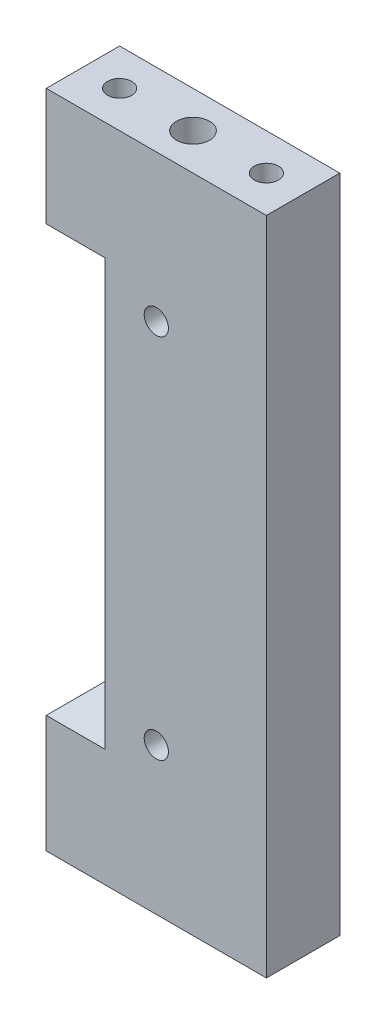
ISO-10303-21;
HEADER;
FILE_DESCRIPTION(('STEP AP214'),'2;1');
FILE_NAME('part.step','',(''),(''),'','','');
FILE_SCHEMA(('AUTOMOTIVE_DESIGN { 1 0 10303 214 1 1 1 1 }'));
ENDSEC;
DATA;
#1=APPLICATION_CONTEXT('core data for automotive mechanical design processes');
#2=APPLICATION_PROTOCOL_DEFINITION('international standard','automotive_design',2000,#1);
#3=PRODUCT_CONTEXT('',#1,'mechanical');
#4=PRODUCT('Part','Part','',(#3));
#5=PRODUCT_RELATED_PRODUCT_CATEGORY('part','',(#4));
#6=PRODUCT_DEFINITION_FORMATION('','',#4);
#7=PRODUCT_DEFINITION_CONTEXT('part definition',#1,'design');
#8=PRODUCT_DEFINITION('design','',#6,#7);
#9=PRODUCT_DEFINITION_SHAPE('','',#8);
#10=(LENGTH_UNIT() NAMED_UNIT(*) SI_UNIT(.MILLI.,.METRE.));
#11=(NAMED_UNIT(*) PLANE_ANGLE_UNIT() SI_UNIT($,.RADIAN.));
#12=(NAMED_UNIT(*) SI_UNIT($,.STERADIAN.) SOLID_ANGLE_UNIT());
#13=UNCERTAINTY_MEASURE_WITH_UNIT(LENGTH_MEASURE(1.E-05),#10,'distance_accuracy_value','');
#14=(GEOMETRIC_REPRESENTATION_CONTEXT(3) GLOBAL_UNCERTAINTY_ASSIGNED_CONTEXT((#13)) GLOBAL_UNIT_ASSIGNED_CONTEXT((#10,
#11,#12)) REPRESENTATION_CONTEXT('',''));
#15=CARTESIAN_POINT('',(0.,0.,0.));
#16=DIRECTION('',(0.,0.,1.));
#17=DIRECTION('',(1.,0.,0.));
#18=AXIS2_PLACEMENT_3D('',#15,#16,#17);
#19=CARTESIAN_POINT('',(15.,90.,5.));
#20=DIRECTION('',(-1.,0.,0.));
#21=DIRECTION('',(0.,0.,1.));
#22=AXIS2_PLACEMENT_3D('',#19,#20,#21);
#23=PLANE('',#22);
#24=DIRECTION('',(0.,0.,-1.));
#25=VECTOR('',#24,1.);
#26=CARTESIAN_POINT('',(15.,0.,5.));
#27=LINE('',#26,#25);
#28=CARTESIAN_POINT('',(15.,0.,5.));
#29=VERTEX_POINT('',#28);
#30=CARTESIAN_POINT('',(15.,0.,-5.));
#31=VERTEX_POINT('',#30);
#32=EDGE_CURVE('E206',#29,#31,#27,.T.);
#33=ORIENTED_EDGE('',*,*,#32,.T.);
#34=DIRECTION('',(0.,-1.,0.));
#35=VECTOR('',#34,1.);
#36=CARTESIAN_POINT('',(15.,90.,-5.));
#37=LINE('',#36,#35);
#38=CARTESIAN_POINT('',(15.,90.,-5.));
#39=VERTEX_POINT('',#38);
#40=EDGE_CURVE('E246',#39,#31,#37,.T.);
#41=ORIENTED_EDGE('',*,*,#40,.F.);
#42=DIRECTION('',(0.,0.,-1.));
#43=VECTOR('',#42,1.);
#44=CARTESIAN_POINT('',(15.,90.,5.));
#45=LINE('',#44,#43);
#46=CARTESIAN_POINT('',(15.,90.,5.));
#47=VERTEX_POINT('',#46);
#48=EDGE_CURVE('E207',#47,#39,#45,.T.);
#49=ORIENTED_EDGE('',*,*,#48,.F.);
#50=DIRECTION('',(0.,-1.,0.));
#51=VECTOR('',#50,1.);
#52=CARTESIAN_POINT('',(15.,90.,5.));
#53=LINE('',#52,#51);
#54=EDGE_CURVE('E221',#47,#29,#53,.T.);
#55=ORIENTED_EDGE('',*,*,#54,.T.);
#56=EDGE_LOOP('',(#33,#41,#49,#55));
#57=FACE_BOUND('',#56,.T.);
#58=ADVANCED_FACE('F47',(#57),#23,.F.);
#59=CARTESIAN_POINT('',(-15.,90.,-5.));
#60=DIRECTION('',(0.,0.,1.));
#61=DIRECTION('',(1.,0.,0.));
#62=AXIS2_PLACEMENT_3D('',#59,#60,#61);
#63=PLANE('',#62);
#64=CARTESIAN_POINT('',(0.,70.,-5.));
#65=DIRECTION('',(0.,0.,1.));
#66=DIRECTION('',(1.,0.,0.));
#67=AXIS2_PLACEMENT_3D('',#64,#65,#66);
#68=CIRCLE('',#67,1.65);
#69=CARTESIAN_POINT('',(1.65,70.,-5.));
#70=VERTEX_POINT('',#69);
#71=EDGE_CURVE('E148',#70,#70,#68,.T.);
#72=ORIENTED_EDGE('',*,*,#71,.T.);
#73=EDGE_LOOP('',(#72));
#74=FACE_BOUND('',#73,.T.);
#75=CARTESIAN_POINT('',(0.,20.,-5.));
#76=DIRECTION('',(0.,0.,1.));
#77=DIRECTION('',(1.,0.,0.));
#78=AXIS2_PLACEMENT_3D('',#75,#76,#77);
#79=CIRCLE('',#78,1.65);
#80=CARTESIAN_POINT('',(1.65,20.,-5.));
#81=VERTEX_POINT('',#80);
#82=EDGE_CURVE('E162',#81,#81,#79,.T.);
#83=ORIENTED_EDGE('',*,*,#82,.T.);
#84=EDGE_LOOP('',(#83));
#85=FACE_BOUND('',#84,.T.);
#86=DIRECTION('',(-1.,0.,0.));
#87=VECTOR('',#86,1.);
#88=CARTESIAN_POINT('',(-15.,0.,-5.));
#89=LINE('',#88,#87);
#90=CARTESIAN_POINT('',(-15.,0.,-5.));
#91=VERTEX_POINT('',#90);
#92=EDGE_CURVE('E225',#31,#91,#89,.T.);
#93=ORIENTED_EDGE('',*,*,#92,.T.);
#94=DIRECTION('',(0.,-1.,0.));
#95=VECTOR('',#94,1.);
#96=CARTESIAN_POINT('',(-15.,90.,-5.));
#97=LINE('',#96,#95);
#98=CARTESIAN_POINT('',(-15.,90.,-5.));
#99=VERTEX_POINT('',#98);
#100=EDGE_CURVE('E242',#99,#91,#97,.T.);
#101=ORIENTED_EDGE('',*,*,#100,.F.);
#102=DIRECTION('',(-1.,0.,0.));
#103=VECTOR('',#102,1.);
#104=CARTESIAN_POINT('',(-15.,90.,-5.));
#105=LINE('',#104,#103);
#106=EDGE_CURVE('E211',#39,#99,#105,.T.);
#107=ORIENTED_EDGE('',*,*,#106,.F.);
#108=ORIENTED_EDGE('',*,*,#40,.T.);
#109=EDGE_LOOP('',(#93,#101,#107,#108));
#110=FACE_BOUND('',#109,.T.);
#111=ADVANCED_FACE('F304',(#74,#85,#110),#63,.F.);
#112=CARTESIAN_POINT('',(-15.,90.,5.));
#113=DIRECTION('',(1.,0.,0.));
#114=DIRECTION('',(0.,0.,-1.));
#115=AXIS2_PLACEMENT_3D('',#112,#113,#114);
#116=PLANE('',#115);
#117=DIRECTION('',(0.,-1.,0.));
#118=VECTOR('',#117,1.);
#119=CARTESIAN_POINT('',(-15.,90.,5.));
#120=LINE('',#119,#118);
#121=CARTESIAN_POINT('',(-15.,16.,5.));
#122=VERTEX_POINT('',#121);
#123=CARTESIAN_POINT('',(-15.,0.,5.));
#124=VERTEX_POINT('',#123);
#125=EDGE_CURVE('E237',#122,#124,#120,.T.);
#126=ORIENTED_EDGE('',*,*,#125,.F.);
#127=DIRECTION('',(0.,0.,-1.));
#128=VECTOR('',#127,1.);
#129=CARTESIAN_POINT('',(-15.,16.,5.));
#130=LINE('',#129,#128);
#131=CARTESIAN_POINT('',(-15.,16.,-3.));
#132=VERTEX_POINT('',#131);
#133=EDGE_CURVE('E261',#122,#132,#130,.T.);
#134=ORIENTED_EDGE('',*,*,#133,.T.);
#135=DIRECTION('',(0.,-1.,0.));
#136=VECTOR('',#135,1.);
#137=CARTESIAN_POINT('',(-15.,20.,-3.));
#138=LINE('',#137,#136);
#139=CARTESIAN_POINT('',(-15.,74.,-3.));
#140=VERTEX_POINT('',#139);
#141=EDGE_CURVE('E273',#140,#132,#138,.T.);
#142=ORIENTED_EDGE('',*,*,#141,.F.);
#143=DIRECTION('',(0.,0.,1.));
#144=VECTOR('',#143,1.);
#145=CARTESIAN_POINT('',(-15.,74.,5.));
#146=LINE('',#145,#144);
#147=CARTESIAN_POINT('',(-15.,74.,5.));
#148=VERTEX_POINT('',#147);
#149=EDGE_CURVE('E258',#140,#148,#146,.T.);
#150=ORIENTED_EDGE('',*,*,#149,.T.);
#151=CARTESIAN_POINT('',(-15.,90.,5.));
#152=VERTEX_POINT('',#151);
#153=EDGE_CURVE('E238',#152,#148,#120,.T.);
#154=ORIENTED_EDGE('',*,*,#153,.F.);
#155=DIRECTION('',(0.,0.,1.));
#156=VECTOR('',#155,1.);
#157=CARTESIAN_POINT('',(-15.,90.,5.));
#158=LINE('',#157,#156);
#159=EDGE_CURVE('E215',#99,#152,#158,.T.);
#160=ORIENTED_EDGE('',*,*,#159,.F.);
#161=ORIENTED_EDGE('',*,*,#100,.T.);
#162=DIRECTION('',(0.,0.,1.));
#163=VECTOR('',#162,1.);
#164=CARTESIAN_POINT('',(-15.,0.,5.));
#165=LINE('',#164,#163);
#166=EDGE_CURVE('E228',#91,#124,#165,.T.);
#167=ORIENTED_EDGE('',*,*,#166,.T.);
#168=EDGE_LOOP('',(#126,#134,#142,#150,#154,#160,#161,#167));
#169=FACE_BOUND('',#168,.T.);
#170=ADVANCED_FACE('F290',(#169),#116,.F.);
#171=CARTESIAN_POINT('',(-15.,90.,5.));
#172=DIRECTION('',(0.,0.,-1.));
#173=DIRECTION('',(-1.,0.,0.));
#174=AXIS2_PLACEMENT_3D('',#171,#172,#173);
#175=PLANE('',#174);
#176=CARTESIAN_POINT('',(0.,70.,5.));
#177=DIRECTION('',(0.,0.,1.));
#178=DIRECTION('',(1.,0.,0.));
#179=AXIS2_PLACEMENT_3D('',#176,#177,#178);
#180=CIRCLE('',#179,1.65);
#181=CARTESIAN_POINT('',(1.65,70.,5.));
#182=VERTEX_POINT('',#181);
#183=EDGE_CURVE('E142',#182,#182,#180,.T.);
#184=ORIENTED_EDGE('',*,*,#183,.F.);
#185=EDGE_LOOP('',(#184));
#186=FACE_BOUND('',#185,.T.);
#187=CARTESIAN_POINT('',(0.,20.,5.));
#188=DIRECTION('',(0.,0.,1.));
#189=DIRECTION('',(1.,0.,0.));
#190=AXIS2_PLACEMENT_3D('',#187,#188,#189);
#191=CIRCLE('',#190,1.65);
#192=CARTESIAN_POINT('',(1.65,20.,5.));
#193=VERTEX_POINT('',#192);
#194=EDGE_CURVE('E158',#193,#193,#191,.T.);
#195=ORIENTED_EDGE('',*,*,#194,.F.);
#196=EDGE_LOOP('',(#195));
#197=FACE_BOUND('',#196,.T.);
#198=DIRECTION('',(0.,1.,0.));
#199=VECTOR('',#198,1.);
#200=CARTESIAN_POINT('',(-7.,20.,5.));
#201=LINE('',#200,#199);
#202=CARTESIAN_POINT('',(-7.,16.,5.));
#203=VERTEX_POINT('',#202);
#204=CARTESIAN_POINT('',(-7.,74.,5.));
#205=VERTEX_POINT('',#204);
#206=EDGE_CURVE('E151',#203,#205,#201,.T.);
#207=ORIENTED_EDGE('',*,*,#206,.F.);
#208=DIRECTION('',(-1.,0.,0.));
#209=VECTOR('',#208,1.);
#210=CARTESIAN_POINT('',(-15.,16.,5.));
#211=LINE('',#210,#209);
#212=EDGE_CURVE('E254',#203,#122,#211,.T.);
#213=ORIENTED_EDGE('',*,*,#212,.T.);
#214=ORIENTED_EDGE('',*,*,#125,.T.);
#215=DIRECTION('',(1.,0.,0.));
#216=VECTOR('',#215,1.);
#217=CARTESIAN_POINT('',(-15.,0.,5.));
#218=LINE('',#217,#216);
#219=EDGE_CURVE('E212',#124,#29,#218,.T.);
#220=ORIENTED_EDGE('',*,*,#219,.T.);
#221=ORIENTED_EDGE('',*,*,#54,.F.);
#222=DIRECTION('',(1.,0.,0.));
#223=VECTOR('',#222,1.);
#224=CARTESIAN_POINT('',(-15.,90.,5.));
#225=LINE('',#224,#223);
#226=EDGE_CURVE('E218',#152,#47,#225,.T.);
#227=ORIENTED_EDGE('',*,*,#226,.F.);
#228=ORIENTED_EDGE('',*,*,#153,.T.);
#229=DIRECTION('',(1.,0.,0.));
#230=VECTOR('',#229,1.);
#231=CARTESIAN_POINT('',(-15.,74.,5.));
#232=LINE('',#231,#230);
#233=EDGE_CURVE('E250',#148,#205,#232,.T.);
#234=ORIENTED_EDGE('',*,*,#233,.T.);
#235=EDGE_LOOP('',(#207,#213,#214,#220,#221,#227,#228,#234));
#236=FACE_BOUND('',#235,.T.);
#237=ADVANCED_FACE('F353',(#186,#197,#236),#175,.F.);
#238=CARTESIAN_POINT('',(0.,90.,0.));
#239=DIRECTION('',(0.,-1.,0.));
#240=DIRECTION('',(0.,0.,-1.));
#241=AXIS2_PLACEMENT_3D('',#238,#239,#240);
#242=PLANE('',#241);
#243=CARTESIAN_POINT('',(0.,90.,0.));
#244=DIRECTION('',(0.,1.,0.));
#245=DIRECTION('',(0.,0.,1.));
#246=AXIS2_PLACEMENT_3D('',#243,#244,#245);
#247=CIRCLE('',#246,2.25);
#248=CARTESIAN_POINT('',(0.,90.,2.25));
#249=VERTEX_POINT('',#248);
#250=EDGE_CURVE('E143',#249,#249,#247,.T.);
#251=ORIENTED_EDGE('',*,*,#250,.F.);
#252=EDGE_LOOP('',(#251));
#253=FACE_BOUND('',#252,.T.);
#254=CARTESIAN_POINT('',(-10.,90.,0.));
#255=DIRECTION('',(0.,1.,0.));
#256=DIRECTION('',(0.,0.,1.));
#257=AXIS2_PLACEMENT_3D('',#254,#255,#256);
#258=CIRCLE('',#257,1.64999999999999);
#259=CARTESIAN_POINT('',(-10.,90.,1.64999999999999));
#260=VERTEX_POINT('',#259);
#261=EDGE_CURVE('E166',#260,#260,#258,.T.);
#262=ORIENTED_EDGE('',*,*,#261,.F.);
#263=EDGE_LOOP('',(#262));
#264=FACE_BOUND('',#263,.T.);
#265=CARTESIAN_POINT('',(10.,90.,0.));
#266=DIRECTION('',(0.,1.,0.));
#267=DIRECTION('',(0.,0.,1.));
#268=AXIS2_PLACEMENT_3D('',#265,#266,#267);
#269=CIRCLE('',#268,1.64999999999999);
#270=CARTESIAN_POINT('',(10.,90.,1.64999999999999));
#271=VERTEX_POINT('',#270);
#272=EDGE_CURVE('E174',#271,#271,#269,.T.);
#273=ORIENTED_EDGE('',*,*,#272,.F.);
#274=EDGE_LOOP('',(#273));
#275=FACE_BOUND('',#274,.T.);
#276=ORIENTED_EDGE('',*,*,#48,.T.);
#277=ORIENTED_EDGE('',*,*,#106,.T.);
#278=ORIENTED_EDGE('',*,*,#159,.T.);
#279=ORIENTED_EDGE('',*,*,#226,.T.);
#280=EDGE_LOOP('',(#276,#277,#278,#279));
#281=FACE_BOUND('',#280,.T.);
#282=ADVANCED_FACE('F358',(#253,#264,#275,#281),#242,.F.);
#283=CARTESIAN_POINT('',(0.,0.,0.));
#284=DIRECTION('',(0.,-1.,0.));
#285=DIRECTION('',(0.,0.,-1.));
#286=AXIS2_PLACEMENT_3D('',#283,#284,#285);
#287=PLANE('',#286);
#288=CARTESIAN_POINT('',(10.,0.,0.));
#289=DIRECTION('',(0.,-1.,0.));
#290=DIRECTION('',(0.,0.,-1.));
#291=AXIS2_PLACEMENT_3D('',#288,#289,#290);
#292=CIRCLE('',#291,1.64999999999999);
#293=CARTESIAN_POINT('',(10.,0.,-1.64999999999999));
#294=VERTEX_POINT('',#293);
#295=EDGE_CURVE('E182',#294,#294,#292,.T.);
#296=ORIENTED_EDGE('',*,*,#295,.F.);
#297=EDGE_LOOP('',(#296));
#298=FACE_BOUND('',#297,.T.);
#299=CARTESIAN_POINT('',(-10.,0.,0.));
#300=DIRECTION('',(0.,-1.,0.));
#301=DIRECTION('',(0.,0.,-1.));
#302=AXIS2_PLACEMENT_3D('',#299,#300,#301);
#303=CIRCLE('',#302,1.64999999999999);
#304=CARTESIAN_POINT('',(-10.,0.,-1.64999999999999));
#305=VERTEX_POINT('',#304);
#306=EDGE_CURVE('E190',#305,#305,#303,.T.);
#307=ORIENTED_EDGE('',*,*,#306,.F.);
#308=EDGE_LOOP('',(#307));
#309=FACE_BOUND('',#308,.T.);
#310=CARTESIAN_POINT('',(0.,0.,0.));
#311=DIRECTION('',(0.,-1.,0.));
#312=DIRECTION('',(0.,0.,-1.));
#313=AXIS2_PLACEMENT_3D('',#310,#311,#312);
#314=CIRCLE('',#313,1.64999999999999);
#315=CARTESIAN_POINT('',(0.,0.,-1.64999999999999));
#316=VERTEX_POINT('',#315);
#317=EDGE_CURVE('E198',#316,#316,#314,.T.);
#318=ORIENTED_EDGE('',*,*,#317,.F.);
#319=EDGE_LOOP('',(#318));
#320=FACE_BOUND('',#319,.T.);
#321=ORIENTED_EDGE('',*,*,#32,.F.);
#322=ORIENTED_EDGE('',*,*,#219,.F.);
#323=ORIENTED_EDGE('',*,*,#166,.F.);
#324=ORIENTED_EDGE('',*,*,#92,.F.);
#325=EDGE_LOOP('',(#321,#322,#323,#324));
#326=FACE_BOUND('',#325,.T.);
#327=ADVANCED_FACE('F393',(#298,#309,#320,#326),#287,.T.);
#328=CARTESIAN_POINT('',(0.,15.,0.));
#329=DIRECTION('',(0.,-1.,0.));
#330=DIRECTION('',(0.,0.,-1.));
#331=AXIS2_PLACEMENT_3D('',#328,#329,#330);
#332=CONICAL_SURFACE('',#331,1.65,1.02974425867665);
#333=CARTESIAN_POINT('',(0.,15.9914200213955,0.));
#334=VERTEX_POINT('',#333);
#335=VERTEX_LOOP('',#334);
#336=FACE_BOUND('',#335,.T.);
#337=CARTESIAN_POINT('',(0.,15.,0.));
#338=DIRECTION('',(0.,-1.,0.));
#339=DIRECTION('',(0.,0.,-1.));
#340=AXIS2_PLACEMENT_3D('',#337,#338,#339);
#341=CIRCLE('',#340,1.65);
#342=CARTESIAN_POINT('',(0.,15.,-1.65));
#343=VERTEX_POINT('',#342);
#344=EDGE_CURVE('E202',#343,#343,#341,.T.);
#345=ORIENTED_EDGE('',*,*,#344,.T.);
#346=EDGE_LOOP('',(#345));
#347=FACE_BOUND('',#346,.T.);
#348=ADVANCED_FACE('F522',(#336,#347),#332,.F.);
#349=CARTESIAN_POINT('',(0.,0.,0.));
#350=DIRECTION('',(0.,-1.,0.));
#351=DIRECTION('',(0.,0.,-1.));
#352=AXIS2_PLACEMENT_3D('',#349,#350,#351);
#353=CYLINDRICAL_SURFACE('',#352,1.64999999999999);
#354=ORIENTED_EDGE('',*,*,#344,.F.);
#355=EDGE_LOOP('',(#354));
#356=FACE_BOUND('',#355,.T.);
#357=ORIENTED_EDGE('',*,*,#317,.T.);
#358=EDGE_LOOP('',(#357));
#359=FACE_BOUND('',#358,.T.);
#360=ADVANCED_FACE('F512',(#356,#359),#353,.F.);
#361=CARTESIAN_POINT('',(-10.,15.,0.));
#362=DIRECTION('',(0.,-1.,0.));
#363=DIRECTION('',(0.,0.,-1.));
#364=AXIS2_PLACEMENT_3D('',#361,#362,#363);
#365=CONICAL_SURFACE('',#364,1.65,1.02974425867665);
#366=CARTESIAN_POINT('',(-10.,15.9914200213955,0.));
#367=VERTEX_POINT('',#366);
#368=VERTEX_LOOP('',#367);
#369=FACE_BOUND('',#368,.T.);
#370=CARTESIAN_POINT('',(-10.,15.,0.));
#371=DIRECTION('',(0.,-1.,0.));
#372=DIRECTION('',(0.,0.,-1.));
#373=AXIS2_PLACEMENT_3D('',#370,#371,#372);
#374=CIRCLE('',#373,1.65);
#375=CARTESIAN_POINT('',(-10.,15.,-1.65));
#376=VERTEX_POINT('',#375);
#377=EDGE_CURVE('E194',#376,#376,#374,.T.);
#378=ORIENTED_EDGE('',*,*,#377,.T.);
#379=EDGE_LOOP('',(#378));
#380=FACE_BOUND('',#379,.T.);
#381=ADVANCED_FACE('F500',(#369,#380),#365,.F.);
#382=CARTESIAN_POINT('',(-10.,0.,0.));
#383=DIRECTION('',(0.,-1.,0.));
#384=DIRECTION('',(0.,0.,-1.));
#385=AXIS2_PLACEMENT_3D('',#382,#383,#384);
#386=CYLINDRICAL_SURFACE('',#385,1.64999999999999);
#387=ORIENTED_EDGE('',*,*,#377,.F.);
#388=EDGE_LOOP('',(#387));
#389=FACE_BOUND('',#388,.T.);
#390=ORIENTED_EDGE('',*,*,#306,.T.);
#391=EDGE_LOOP('',(#390));
#392=FACE_BOUND('',#391,.T.);
#393=ADVANCED_FACE('F490',(#389,#392),#386,.F.);
#394=CARTESIAN_POINT('',(10.,15.,0.));
#395=DIRECTION('',(0.,-1.,0.));
#396=DIRECTION('',(0.,0.,-1.));
#397=AXIS2_PLACEMENT_3D('',#394,#395,#396);
#398=CONICAL_SURFACE('',#397,1.65,1.02974425867665);
#399=CARTESIAN_POINT('',(10.,15.9914200213955,0.));
#400=VERTEX_POINT('',#399);
#401=VERTEX_LOOP('',#400);
#402=FACE_BOUND('',#401,.T.);
#403=CARTESIAN_POINT('',(10.,15.,0.));
#404=DIRECTION('',(0.,-1.,0.));
#405=DIRECTION('',(0.,0.,-1.));
#406=AXIS2_PLACEMENT_3D('',#403,#404,#405);
#407=CIRCLE('',#406,1.65);
#408=CARTESIAN_POINT('',(10.,15.,-1.65));
#409=VERTEX_POINT('',#408);
#410=EDGE_CURVE('E186',#409,#409,#407,.T.);
#411=ORIENTED_EDGE('',*,*,#410,.T.);
#412=EDGE_LOOP('',(#411));
#413=FACE_BOUND('',#412,.T.);
#414=ADVANCED_FACE('F478',(#402,#413),#398,.F.);
#415=CARTESIAN_POINT('',(10.,0.,0.));
#416=DIRECTION('',(0.,-1.,0.));
#417=DIRECTION('',(0.,0.,-1.));
#418=AXIS2_PLACEMENT_3D('',#415,#416,#417);
#419=CYLINDRICAL_SURFACE('',#418,1.64999999999999);
#420=ORIENTED_EDGE('',*,*,#410,.F.);
#421=EDGE_LOOP('',(#420));
#422=FACE_BOUND('',#421,.T.);
#423=ORIENTED_EDGE('',*,*,#295,.T.);
#424=EDGE_LOOP('',(#423));
#425=FACE_BOUND('',#424,.T.);
#426=ADVANCED_FACE('F468',(#422,#425),#419,.F.);
#427=CARTESIAN_POINT('',(10.,75.,0.));
#428=DIRECTION('',(0.,1.,0.));
#429=DIRECTION('',(0.,0.,1.));
#430=AXIS2_PLACEMENT_3D('',#427,#428,#429);
#431=CONICAL_SURFACE('',#430,1.65,1.02974425867665);
#432=CARTESIAN_POINT('',(10.,74.0085799786045,0.));
#433=VERTEX_POINT('',#432);
#434=VERTEX_LOOP('',#433);
#435=FACE_BOUND('',#434,.T.);
#436=CARTESIAN_POINT('',(10.,75.,0.));
#437=DIRECTION('',(0.,1.,0.));
#438=DIRECTION('',(0.,0.,1.));
#439=AXIS2_PLACEMENT_3D('',#436,#437,#438);
#440=CIRCLE('',#439,1.65);
#441=CARTESIAN_POINT('',(10.,75.,1.64999999999999));
#442=VERTEX_POINT('',#441);
#443=EDGE_CURVE('E178',#442,#442,#440,.T.);
#444=ORIENTED_EDGE('',*,*,#443,.T.);
#445=EDGE_LOOP('',(#444));
#446=FACE_BOUND('',#445,.T.);
#447=ADVANCED_FACE('F456',(#435,#446),#431,.F.);
#448=CARTESIAN_POINT('',(10.,90.,0.));
#449=DIRECTION('',(0.,1.,0.));
#450=DIRECTION('',(0.,0.,1.));
#451=AXIS2_PLACEMENT_3D('',#448,#449,#450);
#452=CYLINDRICAL_SURFACE('',#451,1.64999999999999);
#453=ORIENTED_EDGE('',*,*,#443,.F.);
#454=EDGE_LOOP('',(#453));
#455=FACE_BOUND('',#454,.T.);
#456=ORIENTED_EDGE('',*,*,#272,.T.);
#457=EDGE_LOOP('',(#456));
#458=FACE_BOUND('',#457,.T.);
#459=ADVANCED_FACE('F446',(#455,#458),#452,.F.);
#460=CARTESIAN_POINT('',(-10.,75.,0.));
#461=DIRECTION('',(0.,1.,0.));
#462=DIRECTION('',(0.,0.,1.));
#463=AXIS2_PLACEMENT_3D('',#460,#461,#462);
#464=CONICAL_SURFACE('',#463,1.65,1.02974425867665);
#465=CARTESIAN_POINT('',(-10.,74.0085799786045,0.));
#466=VERTEX_POINT('',#465);
#467=VERTEX_LOOP('',#466);
#468=FACE_BOUND('',#467,.T.);
#469=CARTESIAN_POINT('',(-10.,75.,0.));
#470=DIRECTION('',(0.,1.,0.));
#471=DIRECTION('',(0.,0.,1.));
#472=AXIS2_PLACEMENT_3D('',#469,#470,#471);
#473=CIRCLE('',#472,1.65);
#474=CARTESIAN_POINT('',(-10.,75.,1.65));
#475=VERTEX_POINT('',#474);
#476=EDGE_CURVE('E170',#475,#475,#473,.T.);
#477=ORIENTED_EDGE('',*,*,#476,.T.);
#478=EDGE_LOOP('',(#477));
#479=FACE_BOUND('',#478,.T.);
#480=ADVANCED_FACE('F434',(#468,#479),#464,.F.);
#481=CARTESIAN_POINT('',(-10.,90.,0.));
#482=DIRECTION('',(0.,1.,0.));
#483=DIRECTION('',(0.,0.,1.));
#484=AXIS2_PLACEMENT_3D('',#481,#482,#483);
#485=CYLINDRICAL_SURFACE('',#484,1.64999999999999);
#486=ORIENTED_EDGE('',*,*,#476,.F.);
#487=EDGE_LOOP('',(#486));
#488=FACE_BOUND('',#487,.T.);
#489=ORIENTED_EDGE('',*,*,#261,.T.);
#490=EDGE_LOOP('',(#489));
#491=FACE_BOUND('',#490,.T.);
#492=ADVANCED_FACE('F416',(#488,#491),#485,.F.);
#493=CARTESIAN_POINT('',(0.,20.,5.));
#494=DIRECTION('',(0.,0.,1.));
#495=DIRECTION('',(1.,0.,0.));
#496=AXIS2_PLACEMENT_3D('',#493,#494,#495);
#497=CYLINDRICAL_SURFACE('',#496,1.65);
#498=ORIENTED_EDGE('',*,*,#82,.F.);
#499=EDGE_LOOP('',(#498));
#500=FACE_BOUND('',#499,.T.);
#501=ORIENTED_EDGE('',*,*,#194,.T.);
#502=EDGE_LOOP('',(#501));
#503=FACE_BOUND('',#502,.T.);
#504=ADVANCED_FACE('F405',(#500,#503),#497,.F.);
#505=CARTESIAN_POINT('',(0.,70.,5.));
#506=DIRECTION('',(0.,0.,1.));
#507=DIRECTION('',(1.,0.,0.));
#508=AXIS2_PLACEMENT_3D('',#505,#506,#507);
#509=CYLINDRICAL_SURFACE('',#508,1.65);
#510=ORIENTED_EDGE('',*,*,#71,.F.);
#511=EDGE_LOOP('',(#510));
#512=FACE_BOUND('',#511,.T.);
#513=ORIENTED_EDGE('',*,*,#183,.T.);
#514=EDGE_LOOP('',(#513));
#515=FACE_BOUND('',#514,.T.);
#516=ADVANCED_FACE('F135',(#512,#515),#509,.F.);
#517=CARTESIAN_POINT('',(0.,75.,0.));
#518=DIRECTION('',(0.,1.,0.));
#519=DIRECTION('',(0.,0.,1.));
#520=AXIS2_PLACEMENT_3D('',#517,#518,#519);
#521=CONICAL_SURFACE('',#520,2.25,1.02974425867665);
#522=CARTESIAN_POINT('',(0.,73.648063607188,0.));
#523=VERTEX_POINT('',#522);
#524=VERTEX_LOOP('',#523);
#525=FACE_BOUND('',#524,.T.);
#526=CARTESIAN_POINT('',(0.,75.,0.));
#527=DIRECTION('',(0.,1.,0.));
#528=DIRECTION('',(0.,0.,1.));
#529=AXIS2_PLACEMENT_3D('',#526,#527,#528);
#530=CIRCLE('',#529,2.25);
#531=CARTESIAN_POINT('',(0.,75.,2.25));
#532=VERTEX_POINT('',#531);
#533=EDGE_CURVE('E139',#532,#532,#530,.T.);
#534=ORIENTED_EDGE('',*,*,#533,.T.);
#535=EDGE_LOOP('',(#534));
#536=FACE_BOUND('',#535,.T.);
#537=ADVANCED_FACE('F131',(#525,#536),#521,.F.);
#538=CARTESIAN_POINT('',(0.,90.,0.));
#539=DIRECTION('',(0.,1.,0.));
#540=DIRECTION('',(0.,0.,1.));
#541=AXIS2_PLACEMENT_3D('',#538,#539,#540);
#542=CYLINDRICAL_SURFACE('',#541,2.25);
#543=ORIENTED_EDGE('',*,*,#533,.F.);
#544=EDGE_LOOP('',(#543));
#545=FACE_BOUND('',#544,.T.);
#546=ORIENTED_EDGE('',*,*,#250,.T.);
#547=EDGE_LOOP('',(#546));
#548=FACE_BOUND('',#547,.T.);
#549=ADVANCED_FACE('F134',(#545,#548),#542,.F.);
#550=CARTESIAN_POINT('',(-7.,0.,5.00000000000006));
#551=DIRECTION('',(-0.707106781186551,0.,0.707106781186544));
#552=DIRECTION('',(0.,1.,0.));
#553=AXIS2_PLACEMENT_3D('',#550,#551,#552);
#554=PLANE('',#553);
#555=DIRECTION('',(-0.577350269189621,-0.577350269189629,-0.577350269189627));
#556=VECTOR('',#555,1.);
#557=CARTESIAN_POINT('',(-31.6666666666667,49.3333333333331,-19.6666666666668));
#558=LINE('',#557,#556);
#559=CARTESIAN_POINT('',(-11.,70.,0.999999999999999));
#560=VERTEX_POINT('',#559);
#561=EDGE_CURVE('E58',#205,#560,#558,.T.);
#562=ORIENTED_EDGE('',*,*,#561,.T.);
#563=DIRECTION('',(-0.577350269189623,0.577350269189625,-0.577350269189629));
#564=VECTOR('',#563,1.);
#565=CARTESIAN_POINT('',(14.9999999999999,44.,27.0000000000002));
#566=LINE('',#565,#564);
#567=EDGE_CURVE('E11',#560,#140,#566,.T.);
#568=ORIENTED_EDGE('',*,*,#567,.T.);
#569=ORIENTED_EDGE('',*,*,#141,.T.);
#570=DIRECTION('',(0.577350269189623,0.577350269189625,0.577350269189629));
#571=VECTOR('',#570,1.);
#572=CARTESIAN_POINT('',(-15.,16.,-2.99999999999998));
#573=LINE('',#572,#571);
#574=CARTESIAN_POINT('',(-11.,20.,0.999999999999999));
#575=VERTEX_POINT('',#574);
#576=EDGE_CURVE('E71',#132,#575,#573,.T.);
#577=ORIENTED_EDGE('',*,*,#576,.T.);
#578=DIRECTION('',(0.577350269189621,-0.577350269189629,0.577350269189627));
#579=VECTOR('',#578,1.);
#580=CARTESIAN_POINT('',(-1.6666666666667,10.6666666666666,10.3333333333334));
#581=LINE('',#580,#579);
#582=EDGE_CURVE('E265',#575,#203,#581,.T.);
#583=ORIENTED_EDGE('',*,*,#582,.T.);
#584=ORIENTED_EDGE('',*,*,#206,.T.);
#585=EDGE_LOOP('',(#562,#568,#569,#577,#583,#584));
#586=FACE_BOUND('',#585,.T.);
#587=ADVANCED_FACE('F287',(#586),#554,.T.);
#588=CARTESIAN_POINT('',(-11.,20.,-3.));
#589=DIRECTION('',(0.707106781186549,-0.707106781186546,0.));
#590=DIRECTION('',(0.,0.,1.));
#591=AXIS2_PLACEMENT_3D('',#588,#589,#590);
#592=PLANE('',#591);
#593=ORIENTED_EDGE('',*,*,#576,.F.);
#594=ORIENTED_EDGE('',*,*,#133,.F.);
#595=DIRECTION('',(0.577350269189625,0.577350269189627,-0.577350269189625));
#596=VECTOR('',#595,1.);
#597=CARTESIAN_POINT('',(-9.66666666666667,21.3333333333333,-0.333333333333331));
#598=LINE('',#597,#596);
#599=EDGE_CURVE('E271',#575,#122,#598,.F.);
#600=ORIENTED_EDGE('',*,*,#599,.F.);
#601=EDGE_LOOP('',(#593,#594,#600));
#602=FACE_BOUND('',#601,.T.);
#603=ADVANCED_FACE('F292',(#602),#592,.F.);
#604=CARTESIAN_POINT('',(-15.,16.,5.));
#605=DIRECTION('',(0.,-0.707106781186546,-0.707106781186549));
#606=DIRECTION('',(-1.,0.,0.));
#607=AXIS2_PLACEMENT_3D('',#604,#605,#606);
#608=PLANE('',#607);
#609=ORIENTED_EDGE('',*,*,#212,.F.);
#610=ORIENTED_EDGE('',*,*,#582,.F.);
#611=ORIENTED_EDGE('',*,*,#599,.T.);
#612=EDGE_LOOP('',(#609,#610,#611));
#613=FACE_BOUND('',#612,.T.);
#614=ADVANCED_FACE('F294',(#613),#608,.F.);
#615=CARTESIAN_POINT('',(-11.,70.,-3.));
#616=DIRECTION('',(0.707106781186549,0.707106781186546,0.));
#617=DIRECTION('',(0.,0.,-1.));
#618=AXIS2_PLACEMENT_3D('',#615,#616,#617);
#619=PLANE('',#618);
#620=ORIENTED_EDGE('',*,*,#149,.F.);
#621=ORIENTED_EDGE('',*,*,#567,.F.);
#622=DIRECTION('',(-0.577350269189625,0.577350269189627,0.577350269189625));
#623=VECTOR('',#622,1.);
#624=CARTESIAN_POINT('',(-9.66666666666667,68.6666666666667,-0.33333333333333));
#625=LINE('',#624,#623);
#626=EDGE_CURVE('E52',#148,#560,#625,.F.);
#627=ORIENTED_EDGE('',*,*,#626,.F.);
#628=EDGE_LOOP('',(#620,#621,#627));
#629=FACE_BOUND('',#628,.T.);
#630=ADVANCED_FACE('F50',(#629),#619,.F.);
#631=CARTESIAN_POINT('',(-7.,70.,0.999999999999999));
#632=DIRECTION('',(0.,0.707106781186546,-0.707106781186549));
#633=DIRECTION('',(-1.,0.,0.));
#634=AXIS2_PLACEMENT_3D('',#631,#632,#633);
#635=PLANE('',#634);
#636=ORIENTED_EDGE('',*,*,#561,.F.);
#637=ORIENTED_EDGE('',*,*,#233,.F.);
#638=ORIENTED_EDGE('',*,*,#626,.T.);
#639=EDGE_LOOP('',(#636,#637,#638));
#640=FACE_BOUND('',#639,.T.);
#641=ADVANCED_FACE('F284',(#640),#635,.F.);
#642=CLOSED_SHELL('',(#58,#111,#170,#237,#282,#327,#348,#360,#381,#393,#414,#426,#447,#459,#480,
#492,#504,#516,#537,#549,#587,#603,#614,#630,#641));
#643=MANIFOLD_SOLID_BREP('B2',#642);
#644=ADVANCED_BREP_SHAPE_REPRESENTATION('',(#18,#643),#14);
#645=SHAPE_DEFINITION_REPRESENTATION(#9,#644);
ENDSEC;
END-ISO-10303-21;
